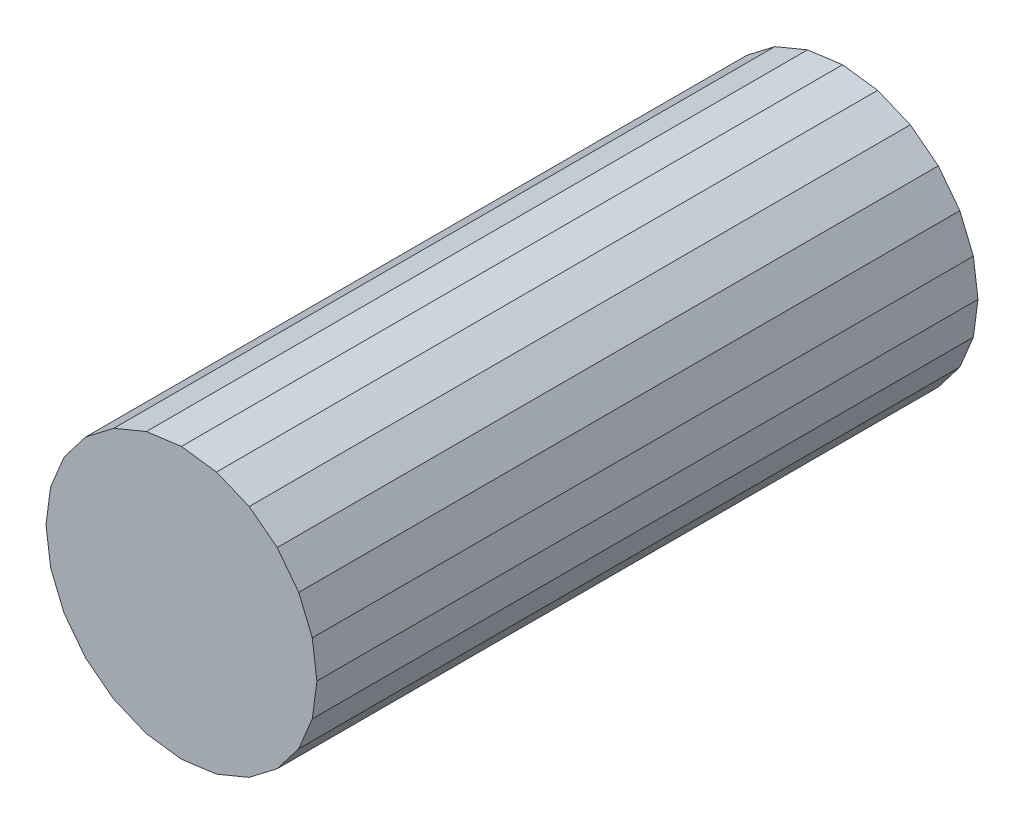
ISO-10303-21;
HEADER;
FILE_DESCRIPTION(('STEP AP214'),'2;1');
FILE_NAME('part.step','',(''),(''),'','','');
FILE_SCHEMA(('AUTOMOTIVE_DESIGN { 1 0 10303 214 1 1 1 1 }'));
ENDSEC;
DATA;
#1=APPLICATION_CONTEXT('core data for automotive mechanical design processes');
#2=APPLICATION_PROTOCOL_DEFINITION('international standard','automotive_design',2000,#1);
#3=PRODUCT_CONTEXT('',#1,'mechanical');
#4=PRODUCT('Part','Part','',(#3));
#5=PRODUCT_RELATED_PRODUCT_CATEGORY('part','',(#4));
#6=PRODUCT_DEFINITION_FORMATION('','',#4);
#7=PRODUCT_DEFINITION_CONTEXT('part definition',#1,'design');
#8=PRODUCT_DEFINITION('design','',#6,#7);
#9=PRODUCT_DEFINITION_SHAPE('','',#8);
#10=(LENGTH_UNIT() NAMED_UNIT(*) SI_UNIT(.MILLI.,.METRE.));
#11=(NAMED_UNIT(*) PLANE_ANGLE_UNIT() SI_UNIT($,.RADIAN.));
#12=(NAMED_UNIT(*) SI_UNIT($,.STERADIAN.) SOLID_ANGLE_UNIT());
#13=UNCERTAINTY_MEASURE_WITH_UNIT(LENGTH_MEASURE(1.E-05),#10,'distance_accuracy_value','');
#14=(GEOMETRIC_REPRESENTATION_CONTEXT(3) GLOBAL_UNCERTAINTY_ASSIGNED_CONTEXT((#13)) GLOBAL_UNIT_ASSIGNED_CONTEXT((#10,
#11,#12)) REPRESENTATION_CONTEXT('',''));
#15=CARTESIAN_POINT('',(0.,0.,0.));
#16=DIRECTION('',(0.,0.,1.));
#17=DIRECTION('',(1.,0.,0.));
#18=AXIS2_PLACEMENT_3D('',#15,#16,#17);
#19=CARTESIAN_POINT('',(0.,-1.3316839,0.));
#20=DIRECTION('',(-0.130529167982954,-0.991444469602649,0.));
#21=DIRECTION('',(0.991444469602649,-0.130529167982954,0.));
#22=AXIS2_PLACEMENT_3D('',#19,#20,#21);
#23=PLANE('',#22);
#24=DIRECTION('',(0.,0.,1.));
#25=VECTOR('',#24,1.);
#26=CARTESIAN_POINT('',(-0.3446653,-1.2863068,0.));
#27=LINE('',#26,#25);
#28=CARTESIAN_POINT('',(-0.3446653,-1.28630680000001,0.));
#29=VERTEX_POINT('',#28);
#30=CARTESIAN_POINT('',(-0.3446653,-1.28630680000001,6.4999997));
#31=VERTEX_POINT('',#30);
#32=EDGE_CURVE('E233',#29,#31,#27,.T.);
#33=ORIENTED_EDGE('',*,*,#32,.F.);
#34=DIRECTION('',(0.991444469602649,-0.130529167982954,0.));
#35=VECTOR('',#34,1.);
#36=CARTESIAN_POINT('',(0.,-1.3316839,0.));
#37=LINE('',#36,#35);
#38=CARTESIAN_POINT('',(0.,-1.3316839,0.));
#39=VERTEX_POINT('',#38);
#40=EDGE_CURVE('E224',#29,#39,#37,.T.);
#41=ORIENTED_EDGE('',*,*,#40,.T.);
#42=DIRECTION('',(0.,0.,1.));
#43=VECTOR('',#42,1.);
#44=CARTESIAN_POINT('',(0.,-1.33168389999999,0.));
#45=LINE('',#44,#43);
#46=CARTESIAN_POINT('',(0.,-1.3316839,6.4999997));
#47=VERTEX_POINT('',#46);
#48=EDGE_CURVE('E235',#47,#39,#45,.F.);
#49=ORIENTED_EDGE('',*,*,#48,.F.);
#50=DIRECTION('',(0.991444469602649,-0.130529167982954,0.));
#51=VECTOR('',#50,1.);
#52=CARTESIAN_POINT('',(0.,-1.3316839,6.4999997));
#53=LINE('',#52,#51);
#54=EDGE_CURVE('E20',#47,#31,#53,.F.);
#55=ORIENTED_EDGE('',*,*,#54,.T.);
#56=EDGE_LOOP('',(#33,#41,#49,#55));
#57=FACE_BOUND('',#56,.T.);
#58=ADVANCED_FACE('F17',(#57),#23,.T.);
#59=CARTESIAN_POINT('',(-0.3446653,-1.2863068,0.));
#60=DIRECTION('',(-0.382683043701045,-0.923879693501109,0.));
#61=DIRECTION('',(0.923879693501109,-0.382683043701045,0.));
#62=AXIS2_PLACEMENT_3D('',#59,#60,#61);
#63=PLANE('',#62);
#64=DIRECTION('',(0.,0.,1.));
#65=VECTOR('',#64,1.);
#66=CARTESIAN_POINT('',(-0.66584068,-1.15327176,0.));
#67=LINE('',#66,#65);
#68=CARTESIAN_POINT('',(-0.665840679999975,-1.15327175999994,0.));
#69=VERTEX_POINT('',#68);
#70=CARTESIAN_POINT('',(-0.665840679999975,-1.15327175999994,6.4999997));
#71=VERTEX_POINT('',#70);
#72=EDGE_CURVE('E276',#69,#71,#67,.T.);
#73=ORIENTED_EDGE('',*,*,#72,.F.);
#74=DIRECTION('',(0.923879693501109,-0.382683043701045,0.));
#75=VECTOR('',#74,1.);
#76=CARTESIAN_POINT('',(-0.3446653,-1.2863068,0.));
#77=LINE('',#76,#75);
#78=EDGE_CURVE('E245',#69,#29,#77,.T.);
#79=ORIENTED_EDGE('',*,*,#78,.T.);
#80=ORIENTED_EDGE('',*,*,#32,.T.);
#81=DIRECTION('',(0.923879693501109,-0.382683043701045,0.));
#82=VECTOR('',#81,1.);
#83=CARTESIAN_POINT('',(-0.3446653,-1.2863068,6.4999997));
#84=LINE('',#83,#82);
#85=EDGE_CURVE('E243',#31,#71,#84,.F.);
#86=ORIENTED_EDGE('',*,*,#85,.T.);
#87=EDGE_LOOP('',(#73,#79,#80,#86));
#88=FACE_BOUND('',#87,.T.);
#89=ADVANCED_FACE('F242',(#88),#63,.T.);
#90=CARTESIAN_POINT('',(0.3446653,-1.2863068,0.));
#91=DIRECTION('',(0.130529167982954,-0.991444469602649,0.));
#92=DIRECTION('',(0.991444469602649,0.130529167982954,0.));
#93=AXIS2_PLACEMENT_3D('',#90,#91,#92);
#94=PLANE('',#93);
#95=ORIENTED_EDGE('',*,*,#48,.T.);
#96=DIRECTION('',(0.991444469602649,0.130529167982954,0.));
#97=VECTOR('',#96,1.);
#98=CARTESIAN_POINT('',(0.3446653,-1.2863068,0.));
#99=LINE('',#98,#97);
#100=CARTESIAN_POINT('',(0.344665300000012,-1.28630680000003,0.));
#101=VERTEX_POINT('',#100);
#102=EDGE_CURVE('E268',#39,#101,#99,.T.);
#103=ORIENTED_EDGE('',*,*,#102,.T.);
#104=DIRECTION('',(0.,0.,1.));
#105=VECTOR('',#104,1.);
#106=CARTESIAN_POINT('',(0.34466530000005,-1.28630680000012,0.));
#107=LINE('',#106,#105);
#108=CARTESIAN_POINT('',(0.344665300000012,-1.28630680000003,6.4999997));
#109=VERTEX_POINT('',#108);
#110=EDGE_CURVE('E287',#109,#101,#107,.F.);
#111=ORIENTED_EDGE('',*,*,#110,.F.);
#112=DIRECTION('',(0.991444469602649,0.130529167982954,0.));
#113=VECTOR('',#112,1.);
#114=CARTESIAN_POINT('',(0.3446653,-1.2863068,6.4999997));
#115=LINE('',#114,#113);
#116=EDGE_CURVE('E259',#109,#47,#115,.F.);
#117=ORIENTED_EDGE('',*,*,#116,.T.);
#118=EDGE_LOOP('',(#95,#103,#111,#117));
#119=FACE_BOUND('',#118,.T.);
#120=ADVANCED_FACE('F266',(#119),#94,.T.);
#121=CARTESIAN_POINT('',(-0.66584068,-1.15327176,0.));
#122=DIRECTION('',(-0.608762963437942,-0.793352162879925,0.));
#123=DIRECTION('',(0.793352162879925,-0.608762963437942,0.));
#124=AXIS2_PLACEMENT_3D('',#121,#122,#123);
#125=PLANE('',#124);
#126=DIRECTION('',(0.,0.,1.));
#127=VECTOR('',#126,1.);
#128=CARTESIAN_POINT('',(-0.9416415,-0.9416415,0.));
#129=LINE('',#128,#127);
#130=CARTESIAN_POINT('',(-0.941641500000008,-0.94164150000001,0.));
#131=VERTEX_POINT('',#130);
#132=CARTESIAN_POINT('',(-0.941641500000008,-0.94164150000001,6.4999997));
#133=VERTEX_POINT('',#132);
#134=EDGE_CURVE('E330',#131,#133,#129,.T.);
#135=ORIENTED_EDGE('',*,*,#134,.F.);
#136=DIRECTION('',(0.793352162879925,-0.608762963437942,0.));
#137=VECTOR('',#136,1.);
#138=CARTESIAN_POINT('',(-0.66584068,-1.15327176,0.));
#139=LINE('',#138,#137);
#140=EDGE_CURVE('E288',#131,#69,#139,.T.);
#141=ORIENTED_EDGE('',*,*,#140,.T.);
#142=ORIENTED_EDGE('',*,*,#72,.T.);
#143=DIRECTION('',(0.793352162879925,-0.608762963437942,0.));
#144=VECTOR('',#143,1.);
#145=CARTESIAN_POINT('',(-0.66584068,-1.15327176,6.4999997));
#146=LINE('',#145,#144);
#147=EDGE_CURVE('E252',#71,#133,#146,.F.);
#148=ORIENTED_EDGE('',*,*,#147,.T.);
#149=EDGE_LOOP('',(#135,#141,#142,#148));
#150=FACE_BOUND('',#149,.T.);
#151=ADVANCED_FACE('F548',(#150),#125,.T.);
#152=CARTESIAN_POINT('',(0.66584068,-1.15327176,0.));
#153=DIRECTION('',(0.382683043701045,-0.923879693501109,0.));
#154=DIRECTION('',(0.923879693501109,0.382683043701045,0.));
#155=AXIS2_PLACEMENT_3D('',#152,#153,#154);
#156=PLANE('',#155);
#157=ORIENTED_EDGE('',*,*,#110,.T.);
#158=DIRECTION('',(0.923879693501109,0.382683043701045,0.));
#159=VECTOR('',#158,1.);
#160=CARTESIAN_POINT('',(0.66584068,-1.15327176,0.));
#161=LINE('',#160,#159);
#162=CARTESIAN_POINT('',(0.665840679999996,-1.15327175999999,0.));
#163=VERTEX_POINT('',#162);
#164=EDGE_CURVE('E275',#101,#163,#161,.T.);
#165=ORIENTED_EDGE('',*,*,#164,.T.);
#166=DIRECTION('',(0.,0.,1.));
#167=VECTOR('',#166,1.);
#168=CARTESIAN_POINT('',(0.665840679999984,-1.15327175999998,0.));
#169=LINE('',#168,#167);
#170=CARTESIAN_POINT('',(0.665840679999996,-1.15327175999999,6.4999997));
#171=VERTEX_POINT('',#170);
#172=EDGE_CURVE('E292',#171,#163,#169,.F.);
#173=ORIENTED_EDGE('',*,*,#172,.F.);
#174=DIRECTION('',(0.923879693501109,0.382683043701045,0.));
#175=VECTOR('',#174,1.);
#176=CARTESIAN_POINT('',(0.66584068,-1.15327176,6.4999997));
#177=LINE('',#176,#175);
#178=EDGE_CURVE('E285',#171,#109,#177,.F.);
#179=ORIENTED_EDGE('',*,*,#178,.T.);
#180=EDGE_LOOP('',(#157,#165,#173,#179));
#181=FACE_BOUND('',#180,.T.);
#182=ADVANCED_FACE('F545',(#181),#156,.T.);
#183=CARTESIAN_POINT('',(-0.9416415,-0.9416415,0.));
#184=DIRECTION('',(-0.79334945515604,-0.608766492182031,0.));
#185=DIRECTION('',(0.608766492182031,-0.79334945515604,0.));
#186=AXIS2_PLACEMENT_3D('',#183,#184,#185);
#187=PLANE('',#186);
#188=DIRECTION('',(0.,0.,1.));
#189=VECTOR('',#188,1.);
#190=CARTESIAN_POINT('',(-1.15327176,-0.66584322,0.));
#191=LINE('',#190,#189);
#192=CARTESIAN_POINT('',(-1.15327175999996,-0.665843219999971,0.));
#193=VERTEX_POINT('',#192);
#194=CARTESIAN_POINT('',(-1.15327175999996,-0.665843219999971,6.4999997));
#195=VERTEX_POINT('',#194);
#196=EDGE_CURVE('E341',#193,#195,#191,.T.);
#197=ORIENTED_EDGE('',*,*,#196,.F.);
#198=DIRECTION('',(0.608766492182031,-0.79334945515604,0.));
#199=VECTOR('',#198,1.);
#200=CARTESIAN_POINT('',(-0.9416415,-0.9416415,0.));
#201=LINE('',#200,#199);
#202=EDGE_CURVE('E293',#193,#131,#201,.T.);
#203=ORIENTED_EDGE('',*,*,#202,.T.);
#204=ORIENTED_EDGE('',*,*,#134,.T.);
#205=DIRECTION('',(0.608766492182031,-0.79334945515604,0.));
#206=VECTOR('',#205,1.);
#207=CARTESIAN_POINT('',(-0.9416415,-0.9416415,6.4999997));
#208=LINE('',#207,#206);
#209=EDGE_CURVE('E320',#133,#195,#208,.F.);
#210=ORIENTED_EDGE('',*,*,#209,.T.);
#211=EDGE_LOOP('',(#197,#203,#204,#210));
#212=FACE_BOUND('',#211,.T.);
#213=ADVANCED_FACE('F547',(#212),#187,.T.);
#214=CARTESIAN_POINT('',(0.9416415,-0.9416415,0.));
#215=DIRECTION('',(0.608762963437942,-0.793352162879925,0.));
#216=DIRECTION('',(0.793352162879925,0.608762963437942,0.));
#217=AXIS2_PLACEMENT_3D('',#214,#215,#216);
#218=PLANE('',#217);
#219=ORIENTED_EDGE('',*,*,#172,.T.);
#220=DIRECTION('',(0.793352162879925,0.608762963437942,0.));
#221=VECTOR('',#220,1.);
#222=CARTESIAN_POINT('',(0.9416415,-0.9416415,0.));
#223=LINE('',#222,#221);
#224=CARTESIAN_POINT('',(0.941641500000019,-0.941641500000014,0.));
#225=VERTEX_POINT('',#224);
#226=EDGE_CURVE('E338',#163,#225,#223,.T.);
#227=ORIENTED_EDGE('',*,*,#226,.T.);
#228=DIRECTION('',(0.,0.,1.));
#229=VECTOR('',#228,1.);
#230=CARTESIAN_POINT('',(0.941641500000074,-0.941641500000057,0.));
#231=LINE('',#230,#229);
#232=CARTESIAN_POINT('',(0.941641500000019,-0.941641500000014,6.4999997));
#233=VERTEX_POINT('',#232);
#234=EDGE_CURVE('E297',#233,#225,#231,.F.);
#235=ORIENTED_EDGE('',*,*,#234,.F.);
#236=DIRECTION('',(0.793352162879925,0.608762963437942,0.));
#237=VECTOR('',#236,1.);
#238=CARTESIAN_POINT('',(0.9416415,-0.9416415,6.4999997));
#239=LINE('',#238,#237);
#240=EDGE_CURVE('E290',#233,#171,#239,.F.);
#241=ORIENTED_EDGE('',*,*,#240,.T.);
#242=EDGE_LOOP('',(#219,#227,#235,#241));
#243=FACE_BOUND('',#242,.T.);
#244=ADVANCED_FACE('F541',(#243),#218,.T.);
#245=CARTESIAN_POINT('',(-1.15327176,-0.66584322,0.));
#246=DIRECTION('',(-0.923880763494145,-0.38268046049606,0.));
#247=DIRECTION('',(0.38268046049606,-0.923880763494145,0.));
#248=AXIS2_PLACEMENT_3D('',#245,#246,#247);
#249=PLANE('',#248);
#250=DIRECTION('',(0.,0.,1.));
#251=VECTOR('',#250,1.);
#252=CARTESIAN_POINT('',(-1.2863068,-0.3446653,0.));
#253=LINE('',#252,#251);
#254=CARTESIAN_POINT('',(-1.28630680000004,-0.344665300000018,0.));
#255=VERTEX_POINT('',#254);
#256=CARTESIAN_POINT('',(-1.28630680000004,-0.344665300000018,6.4999997));
#257=VERTEX_POINT('',#256);
#258=EDGE_CURVE('E353',#255,#257,#253,.T.);
#259=ORIENTED_EDGE('',*,*,#258,.F.);
#260=DIRECTION('',(0.38268046049606,-0.923880763494145,0.));
#261=VECTOR('',#260,1.);
#262=CARTESIAN_POINT('',(-1.15327176,-0.66584322,0.));
#263=LINE('',#262,#261);
#264=EDGE_CURVE('E298',#255,#193,#263,.T.);
#265=ORIENTED_EDGE('',*,*,#264,.T.);
#266=ORIENTED_EDGE('',*,*,#196,.T.);
#267=DIRECTION('',(0.38268046049606,-0.923880763494145,0.));
#268=VECTOR('',#267,1.);
#269=CARTESIAN_POINT('',(-1.15327176,-0.66584322,6.4999997));
#270=LINE('',#269,#268);
#271=EDGE_CURVE('E316',#195,#257,#270,.F.);
#272=ORIENTED_EDGE('',*,*,#271,.T.);
#273=EDGE_LOOP('',(#259,#265,#266,#272));
#274=FACE_BOUND('',#273,.T.);
#275=ADVANCED_FACE('F609',(#274),#249,.T.);
#276=CARTESIAN_POINT('',(1.15327176,-0.66584322,0.));
#277=DIRECTION('',(0.79334945515604,-0.608766492182031,0.));
#278=DIRECTION('',(0.608766492182031,0.79334945515604,0.));
#279=AXIS2_PLACEMENT_3D('',#276,#277,#278);
#280=PLANE('',#279);
#281=ORIENTED_EDGE('',*,*,#234,.T.);
#282=DIRECTION('',(0.608766492182031,0.79334945515604,0.));
#283=VECTOR('',#282,1.);
#284=CARTESIAN_POINT('',(1.15327176,-0.66584322,0.));
#285=LINE('',#284,#283);
#286=CARTESIAN_POINT('',(1.15327175999998,-0.665843219999991,0.));
#287=VERTEX_POINT('',#286);
#288=EDGE_CURVE('E350',#225,#287,#285,.T.);
#289=ORIENTED_EDGE('',*,*,#288,.T.);
#290=DIRECTION('',(0.,0.,1.));
#291=VECTOR('',#290,1.);
#292=CARTESIAN_POINT('',(1.15327175999991,-0.665843219999964,0.));
#293=LINE('',#292,#291);
#294=CARTESIAN_POINT('',(1.15327175999998,-0.665843219999992,6.4999997));
#295=VERTEX_POINT('',#294);
#296=EDGE_CURVE('E307',#295,#287,#293,.F.);
#297=ORIENTED_EDGE('',*,*,#296,.F.);
#298=DIRECTION('',(0.608766492182031,0.79334945515604,0.));
#299=VECTOR('',#298,1.);
#300=CARTESIAN_POINT('',(1.15327176,-0.66584322,6.4999997));
#301=LINE('',#300,#299);
#302=EDGE_CURVE('E295',#295,#233,#301,.F.);
#303=ORIENTED_EDGE('',*,*,#302,.T.);
#304=EDGE_LOOP('',(#281,#289,#297,#303));
#305=FACE_BOUND('',#304,.T.);
#306=ADVANCED_FACE('F537',(#305),#280,.T.);
#307=CARTESIAN_POINT('',(-1.2863068,-0.3446653,0.));
#308=DIRECTION('',(-0.991444469602649,-0.130529167982954,0.));
#309=DIRECTION('',(0.130529167982954,-0.991444469602649,0.));
#310=AXIS2_PLACEMENT_3D('',#307,#308,#309);
#311=PLANE('',#310);
#312=DIRECTION('',(0.,0.,1.));
#313=VECTOR('',#312,1.);
#314=CARTESIAN_POINT('',(-1.3316839,0.,0.));
#315=LINE('',#314,#313);
#316=CARTESIAN_POINT('',(-1.33168389999999,0.,0.));
#317=VERTEX_POINT('',#316);
#318=CARTESIAN_POINT('',(-1.33168389999999,0.,6.4999997));
#319=VERTEX_POINT('',#318);
#320=EDGE_CURVE('E365',#317,#319,#315,.T.);
#321=ORIENTED_EDGE('',*,*,#320,.F.);
#322=DIRECTION('',(0.130529167982954,-0.991444469602649,0.));
#323=VECTOR('',#322,1.);
#324=CARTESIAN_POINT('',(-1.2863068,-0.3446653,0.));
#325=LINE('',#324,#323);
#326=EDGE_CURVE('E308',#317,#255,#325,.T.);
#327=ORIENTED_EDGE('',*,*,#326,.T.);
#328=ORIENTED_EDGE('',*,*,#258,.T.);
#329=DIRECTION('',(0.130529167982954,-0.991444469602649,0.));
#330=VECTOR('',#329,1.);
#331=CARTESIAN_POINT('',(-1.2863068,-0.3446653,6.4999997));
#332=LINE('',#331,#330);
#333=EDGE_CURVE('E312',#257,#319,#332,.F.);
#334=ORIENTED_EDGE('',*,*,#333,.T.);
#335=EDGE_LOOP('',(#321,#327,#328,#334));
#336=FACE_BOUND('',#335,.T.);
#337=ADVANCED_FACE('F603',(#336),#311,.T.);
#338=CARTESIAN_POINT('',(1.2863068,-0.3446653,0.));
#339=DIRECTION('',(0.923880763494145,-0.38268046049606,0.));
#340=DIRECTION('',(0.38268046049606,0.923880763494145,0.));
#341=AXIS2_PLACEMENT_3D('',#338,#339,#340);
#342=PLANE('',#341);
#343=ORIENTED_EDGE('',*,*,#296,.T.);
#344=DIRECTION('',(0.38268046049606,0.923880763494145,0.));
#345=VECTOR('',#344,1.);
#346=CARTESIAN_POINT('',(1.2863068,-0.3446653,0.));
#347=LINE('',#346,#345);
#348=CARTESIAN_POINT('',(1.2863068,-0.344665300000001,0.));
#349=VERTEX_POINT('',#348);
#350=EDGE_CURVE('E362',#287,#349,#347,.T.);
#351=ORIENTED_EDGE('',*,*,#350,.T.);
#352=DIRECTION('',(0.,0.,1.));
#353=VECTOR('',#352,1.);
#354=CARTESIAN_POINT('',(1.28630680000001,-0.344665300000002,0.));
#355=LINE('',#354,#353);
#356=CARTESIAN_POINT('',(1.2863068,-0.344665300000001,6.4999997));
#357=VERTEX_POINT('',#356);
#358=EDGE_CURVE('E302',#357,#349,#355,.F.);
#359=ORIENTED_EDGE('',*,*,#358,.F.);
#360=DIRECTION('',(0.38268046049606,0.923880763494145,0.));
#361=VECTOR('',#360,1.);
#362=CARTESIAN_POINT('',(1.2863068,-0.3446653,6.4999997));
#363=LINE('',#362,#361);
#364=EDGE_CURVE('E305',#357,#295,#363,.F.);
#365=ORIENTED_EDGE('',*,*,#364,.T.);
#366=EDGE_LOOP('',(#343,#351,#359,#365));
#367=FACE_BOUND('',#366,.T.);
#368=ADVANCED_FACE('F533',(#367),#342,.T.);
#369=CARTESIAN_POINT('',(-1.3316839,0.,0.));
#370=DIRECTION('',(-0.991444469602649,0.130529167982954,0.));
#371=DIRECTION('',(-0.130529167982954,-0.991444469602649,0.));
#372=AXIS2_PLACEMENT_3D('',#369,#370,#371);
#373=PLANE('',#372);
#374=DIRECTION('',(0.,0.,1.));
#375=VECTOR('',#374,1.);
#376=CARTESIAN_POINT('',(-1.2863068,0.3446653,0.));
#377=LINE('',#376,#375);
#378=CARTESIAN_POINT('',(-1.28630680000001,0.344665300000001,0.));
#379=VERTEX_POINT('',#378);
#380=CARTESIAN_POINT('',(-1.28630680000001,0.344665300000001,6.4999997));
#381=VERTEX_POINT('',#380);
#382=EDGE_CURVE('E381',#379,#381,#377,.T.);
#383=ORIENTED_EDGE('',*,*,#382,.F.);
#384=DIRECTION('',(-0.130529167982954,-0.991444469602649,0.));
#385=VECTOR('',#384,1.);
#386=CARTESIAN_POINT('',(-1.3316839,0.,0.));
#387=LINE('',#386,#385);
#388=EDGE_CURVE('E303',#379,#317,#387,.T.);
#389=ORIENTED_EDGE('',*,*,#388,.T.);
#390=ORIENTED_EDGE('',*,*,#320,.T.);
#391=DIRECTION('',(-0.130529167982954,-0.991444469602649,0.));
#392=VECTOR('',#391,1.);
#393=CARTESIAN_POINT('',(-1.3316839,0.,6.4999997));
#394=LINE('',#393,#392);
#395=EDGE_CURVE('E369',#319,#381,#394,.F.);
#396=ORIENTED_EDGE('',*,*,#395,.T.);
#397=EDGE_LOOP('',(#383,#389,#390,#396));
#398=FACE_BOUND('',#397,.T.);
#399=ADVANCED_FACE('F597',(#398),#373,.T.);
#400=CARTESIAN_POINT('',(1.3316839,0.,0.));
#401=DIRECTION('',(0.991444469602649,-0.130529167982954,0.));
#402=DIRECTION('',(0.130529167982954,0.991444469602649,0.));
#403=AXIS2_PLACEMENT_3D('',#400,#401,#402);
#404=PLANE('',#403);
#405=ORIENTED_EDGE('',*,*,#358,.T.);
#406=DIRECTION('',(0.130529167982954,0.991444469602649,0.));
#407=VECTOR('',#406,1.);
#408=CARTESIAN_POINT('',(1.3316839,0.,0.));
#409=LINE('',#408,#407);
#410=CARTESIAN_POINT('',(1.3316839,0.,0.));
#411=VERTEX_POINT('',#410);
#412=EDGE_CURVE('E378',#349,#411,#409,.T.);
#413=ORIENTED_EDGE('',*,*,#412,.T.);
#414=DIRECTION('',(0.,0.,1.));
#415=VECTOR('',#414,1.);
#416=CARTESIAN_POINT('',(1.33168389999999,0.,0.));
#417=LINE('',#416,#415);
#418=CARTESIAN_POINT('',(1.3316839,0.,6.4999997));
#419=VERTEX_POINT('',#418);
#420=EDGE_CURVE('E395',#419,#411,#417,.F.);
#421=ORIENTED_EDGE('',*,*,#420,.F.);
#422=DIRECTION('',(0.130529167982954,0.991444469602649,0.));
#423=VECTOR('',#422,1.);
#424=CARTESIAN_POINT('',(1.3316839,0.,6.4999997));
#425=LINE('',#424,#423);
#426=EDGE_CURVE('E300',#419,#357,#425,.F.);
#427=ORIENTED_EDGE('',*,*,#426,.T.);
#428=EDGE_LOOP('',(#405,#413,#421,#427));
#429=FACE_BOUND('',#428,.T.);
#430=ADVANCED_FACE('F529',(#429),#404,.T.);
#431=CARTESIAN_POINT('',(-1.2863068,0.3446653,0.));
#432=DIRECTION('',(-0.923880763494145,0.38268046049606,0.));
#433=DIRECTION('',(-0.38268046049606,-0.923880763494145,0.));
#434=AXIS2_PLACEMENT_3D('',#431,#432,#433);
#435=PLANE('',#434);
#436=DIRECTION('',(0.,0.,1.));
#437=VECTOR('',#436,1.);
#438=CARTESIAN_POINT('',(-1.15327176,0.66584322,0.));
#439=LINE('',#438,#437);
#440=CARTESIAN_POINT('',(-1.15327175999996,0.665843219999982,0.));
#441=VERTEX_POINT('',#440);
#442=CARTESIAN_POINT('',(-1.15327175999996,0.665843219999982,6.4999997));
#443=VERTEX_POINT('',#442);
#444=EDGE_CURVE('E402',#441,#443,#439,.T.);
#445=ORIENTED_EDGE('',*,*,#444,.F.);
#446=DIRECTION('',(-0.38268046049606,-0.923880763494145,0.));
#447=VECTOR('',#446,1.);
#448=CARTESIAN_POINT('',(-1.2863068,0.3446653,0.));
#449=LINE('',#448,#447);
#450=EDGE_CURVE('E388',#441,#379,#449,.T.);
#451=ORIENTED_EDGE('',*,*,#450,.T.);
#452=ORIENTED_EDGE('',*,*,#382,.T.);
#453=DIRECTION('',(-0.38268046049606,-0.923880763494145,0.));
#454=VECTOR('',#453,1.);
#455=CARTESIAN_POINT('',(-1.2863068,0.3446653,6.4999997));
#456=LINE('',#455,#454);
#457=EDGE_CURVE('E385',#381,#443,#456,.F.);
#458=ORIENTED_EDGE('',*,*,#457,.T.);
#459=EDGE_LOOP('',(#445,#451,#452,#458));
#460=FACE_BOUND('',#459,.T.);
#461=ADVANCED_FACE('F591',(#460),#435,.T.);
#462=CARTESIAN_POINT('',(1.2863068,0.3446653,0.));
#463=DIRECTION('',(0.991444469602649,0.130529167982954,0.));
#464=DIRECTION('',(-0.130529167982954,0.991444469602649,0.));
#465=AXIS2_PLACEMENT_3D('',#462,#463,#464);
#466=PLANE('',#465);
#467=ORIENTED_EDGE('',*,*,#420,.T.);
#468=DIRECTION('',(-0.130529167982954,0.991444469602649,0.));
#469=VECTOR('',#468,1.);
#470=CARTESIAN_POINT('',(1.2863068,0.3446653,0.));
#471=LINE('',#470,#469);
#472=CARTESIAN_POINT('',(1.28630680000002,0.344665300000009,0.));
#473=VERTEX_POINT('',#472);
#474=EDGE_CURVE('E399',#411,#473,#471,.T.);
#475=ORIENTED_EDGE('',*,*,#474,.T.);
#476=DIRECTION('',(0.,0.,1.));
#477=VECTOR('',#476,1.);
#478=CARTESIAN_POINT('',(1.28630680000009,0.344665300000035,0.));
#479=LINE('',#478,#477);
#480=CARTESIAN_POINT('',(1.28630680000002,0.344665300000008,6.4999997));
#481=VERTEX_POINT('',#480);
#482=EDGE_CURVE('E416',#481,#473,#479,.F.);
#483=ORIENTED_EDGE('',*,*,#482,.F.);
#484=DIRECTION('',(-0.130529167982954,0.991444469602649,0.));
#485=VECTOR('',#484,1.);
#486=CARTESIAN_POINT('',(1.2863068,0.3446653,6.4999997));
#487=LINE('',#486,#485);
#488=EDGE_CURVE('E392',#481,#419,#487,.F.);
#489=ORIENTED_EDGE('',*,*,#488,.T.);
#490=EDGE_LOOP('',(#467,#475,#483,#489));
#491=FACE_BOUND('',#490,.T.);
#492=ADVANCED_FACE('F522',(#491),#466,.T.);
#493=CARTESIAN_POINT('',(-1.15327176,0.66584322,0.));
#494=DIRECTION('',(-0.79334945515604,0.608766492182031,0.));
#495=DIRECTION('',(-0.608766492182031,-0.79334945515604,0.));
#496=AXIS2_PLACEMENT_3D('',#493,#494,#495);
#497=PLANE('',#496);
#498=DIRECTION('',(0.,0.,1.));
#499=VECTOR('',#498,1.);
#500=CARTESIAN_POINT('',(-0.9416415,0.9416415,0.));
#501=LINE('',#500,#499);
#502=CARTESIAN_POINT('',(-0.941641500000037,0.941641500000028,0.));
#503=VERTEX_POINT('',#502);
#504=CARTESIAN_POINT('',(-0.941641500000037,0.941641500000028,6.4999997));
#505=VERTEX_POINT('',#504);
#506=EDGE_CURVE('E423',#503,#505,#501,.T.);
#507=ORIENTED_EDGE('',*,*,#506,.F.);
#508=DIRECTION('',(-0.608766492182031,-0.79334945515604,0.));
#509=VECTOR('',#508,1.);
#510=CARTESIAN_POINT('',(-1.15327176,0.66584322,0.));
#511=LINE('',#510,#509);
#512=EDGE_CURVE('E409',#503,#441,#511,.T.);
#513=ORIENTED_EDGE('',*,*,#512,.T.);
#514=ORIENTED_EDGE('',*,*,#444,.T.);
#515=DIRECTION('',(-0.608766492182031,-0.79334945515604,0.));
#516=VECTOR('',#515,1.);
#517=CARTESIAN_POINT('',(-1.15327176,0.66584322,6.4999997));
#518=LINE('',#517,#516);
#519=EDGE_CURVE('E406',#443,#505,#518,.F.);
#520=ORIENTED_EDGE('',*,*,#519,.T.);
#521=EDGE_LOOP('',(#507,#513,#514,#520));
#522=FACE_BOUND('',#521,.T.);
#523=ADVANCED_FACE('F585',(#522),#497,.T.);
#524=CARTESIAN_POINT('',(1.15327176,0.66584322,0.));
#525=DIRECTION('',(0.923880763494145,0.38268046049606,0.));
#526=DIRECTION('',(-0.38268046049606,0.923880763494145,0.));
#527=AXIS2_PLACEMENT_3D('',#524,#525,#526);
#528=PLANE('',#527);
#529=ORIENTED_EDGE('',*,*,#482,.T.);
#530=DIRECTION('',(-0.38268046049606,0.923880763494145,0.));
#531=VECTOR('',#530,1.);
#532=CARTESIAN_POINT('',(1.15327176,0.66584322,0.));
#533=LINE('',#532,#531);
#534=CARTESIAN_POINT('',(1.15327175999998,0.665843219999986,0.));
#535=VERTEX_POINT('',#534);
#536=EDGE_CURVE('E420',#473,#535,#533,.T.);
#537=ORIENTED_EDGE('',*,*,#536,.T.);
#538=DIRECTION('',(0.,0.,1.));
#539=VECTOR('',#538,1.);
#540=CARTESIAN_POINT('',(1.15327175999993,0.665843219999943,0.));
#541=LINE('',#540,#539);
#542=CARTESIAN_POINT('',(1.15327175999998,0.665843219999986,6.4999997));
#543=VERTEX_POINT('',#542);
#544=EDGE_CURVE('E437',#543,#535,#541,.F.);
#545=ORIENTED_EDGE('',*,*,#544,.F.);
#546=DIRECTION('',(-0.38268046049606,0.923880763494145,0.));
#547=VECTOR('',#546,1.);
#548=CARTESIAN_POINT('',(1.15327176,0.66584322,6.4999997));
#549=LINE('',#548,#547);
#550=EDGE_CURVE('E413',#543,#481,#549,.F.);
#551=ORIENTED_EDGE('',*,*,#550,.T.);
#552=EDGE_LOOP('',(#529,#537,#545,#551));
#553=FACE_BOUND('',#552,.T.);
#554=ADVANCED_FACE('F518',(#553),#528,.T.);
#555=CARTESIAN_POINT('',(-0.9416415,0.9416415,0.));
#556=DIRECTION('',(-0.608762963437942,0.793352162879925,0.));
#557=DIRECTION('',(-0.793352162879925,-0.608762963437942,0.));
#558=AXIS2_PLACEMENT_3D('',#555,#556,#557);
#559=PLANE('',#558);
#560=DIRECTION('',(0.,0.,1.));
#561=VECTOR('',#560,1.);
#562=CARTESIAN_POINT('',(-0.66584068,1.15327176,0.));
#563=LINE('',#562,#561);
#564=CARTESIAN_POINT('',(-0.665840679999992,1.15327175999999,0.));
#565=VERTEX_POINT('',#564);
#566=CARTESIAN_POINT('',(-0.665840679999992,1.15327175999999,6.4999997));
#567=VERTEX_POINT('',#566);
#568=EDGE_CURVE('E444',#565,#567,#563,.T.);
#569=ORIENTED_EDGE('',*,*,#568,.F.);
#570=DIRECTION('',(-0.793352162879925,-0.608762963437942,0.));
#571=VECTOR('',#570,1.);
#572=CARTESIAN_POINT('',(-0.9416415,0.9416415,0.));
#573=LINE('',#572,#571);
#574=EDGE_CURVE('E430',#565,#503,#573,.T.);
#575=ORIENTED_EDGE('',*,*,#574,.T.);
#576=ORIENTED_EDGE('',*,*,#506,.T.);
#577=DIRECTION('',(-0.793352162879925,-0.608762963437942,0.));
#578=VECTOR('',#577,1.);
#579=CARTESIAN_POINT('',(-0.9416415,0.9416415,6.4999997));
#580=LINE('',#579,#578);
#581=EDGE_CURVE('E427',#505,#567,#580,.F.);
#582=ORIENTED_EDGE('',*,*,#581,.T.);
#583=EDGE_LOOP('',(#569,#575,#576,#582));
#584=FACE_BOUND('',#583,.T.);
#585=ADVANCED_FACE('F579',(#584),#559,.T.);
#586=CARTESIAN_POINT('',(0.9416415,0.9416415,0.));
#587=DIRECTION('',(0.79334945515604,0.608766492182031,0.));
#588=DIRECTION('',(-0.608766492182031,0.79334945515604,0.));
#589=AXIS2_PLACEMENT_3D('',#586,#587,#588);
#590=PLANE('',#589);
#591=ORIENTED_EDGE('',*,*,#544,.T.);
#592=DIRECTION('',(-0.608766492182031,0.79334945515604,0.));
#593=VECTOR('',#592,1.);
#594=CARTESIAN_POINT('',(0.9416415,0.9416415,0.));
#595=LINE('',#594,#593);
#596=CARTESIAN_POINT('',(0.941641500000004,0.941641500000005,0.));
#597=VERTEX_POINT('',#596);
#598=EDGE_CURVE('E441',#535,#597,#595,.T.);
#599=ORIENTED_EDGE('',*,*,#598,.T.);
#600=DIRECTION('',(0.,0.,1.));
#601=VECTOR('',#600,1.);
#602=CARTESIAN_POINT('',(0.941641500000016,0.941641500000021,0.));
#603=LINE('',#602,#601);
#604=CARTESIAN_POINT('',(0.941641500000004,0.941641500000005,6.4999997));
#605=VERTEX_POINT('',#604);
#606=EDGE_CURVE('E455',#605,#597,#603,.F.);
#607=ORIENTED_EDGE('',*,*,#606,.F.);
#608=DIRECTION('',(-0.608766492182031,0.79334945515604,0.));
#609=VECTOR('',#608,1.);
#610=CARTESIAN_POINT('',(0.9416415,0.9416415,6.4999997));
#611=LINE('',#610,#609);
#612=EDGE_CURVE('E434',#605,#543,#611,.F.);
#613=ORIENTED_EDGE('',*,*,#612,.T.);
#614=EDGE_LOOP('',(#591,#599,#607,#613));
#615=FACE_BOUND('',#614,.T.);
#616=ADVANCED_FACE('F514',(#615),#590,.T.);
#617=CARTESIAN_POINT('',(-0.66584068,1.15327176,0.));
#618=DIRECTION('',(-0.382683043701045,0.923879693501109,0.));
#619=DIRECTION('',(-0.923879693501109,-0.382683043701045,0.));
#620=AXIS2_PLACEMENT_3D('',#617,#618,#619);
#621=PLANE('',#620);
#622=DIRECTION('',(0.,0.,1.));
#623=VECTOR('',#622,1.);
#624=CARTESIAN_POINT('',(-0.3446653,1.2863068,0.));
#625=LINE('',#624,#623);
#626=CARTESIAN_POINT('',(-0.344665300000025,1.28630680000006,0.));
#627=VERTEX_POINT('',#626);
#628=CARTESIAN_POINT('',(-0.344665300000025,1.28630680000006,6.4999997));
#629=VERTEX_POINT('',#628);
#630=EDGE_CURVE('E462',#627,#629,#625,.T.);
#631=ORIENTED_EDGE('',*,*,#630,.F.);
#632=DIRECTION('',(-0.923879693501109,-0.382683043701045,0.));
#633=VECTOR('',#632,1.);
#634=CARTESIAN_POINT('',(-0.66584068,1.15327176,0.));
#635=LINE('',#634,#633);
#636=EDGE_CURVE('E451',#627,#565,#635,.T.);
#637=ORIENTED_EDGE('',*,*,#636,.T.);
#638=ORIENTED_EDGE('',*,*,#568,.T.);
#639=DIRECTION('',(-0.923879693501109,-0.382683043701045,0.));
#640=VECTOR('',#639,1.);
#641=CARTESIAN_POINT('',(-0.66584068,1.15327176,6.4999997));
#642=LINE('',#641,#640);
#643=EDGE_CURVE('E448',#567,#629,#642,.F.);
#644=ORIENTED_EDGE('',*,*,#643,.T.);
#645=EDGE_LOOP('',(#631,#637,#638,#644));
#646=FACE_BOUND('',#645,.T.);
#647=ADVANCED_FACE('F573',(#646),#621,.T.);
#648=CARTESIAN_POINT('',(0.66584068,1.15327176,0.));
#649=DIRECTION('',(0.608762963437942,0.793352162879925,0.));
#650=DIRECTION('',(-0.793352162879925,0.608762963437942,0.));
#651=AXIS2_PLACEMENT_3D('',#648,#649,#650);
#652=PLANE('',#651);
#653=ORIENTED_EDGE('',*,*,#606,.T.);
#654=DIRECTION('',(-0.793352162879925,0.608762963437942,0.));
#655=VECTOR('',#654,1.);
#656=CARTESIAN_POINT('',(0.66584068,1.15327176,0.));
#657=LINE('',#656,#655);
#658=CARTESIAN_POINT('',(0.665840679999988,1.15327175999997,0.));
#659=VERTEX_POINT('',#658);
#660=EDGE_CURVE('E459',#597,#659,#657,.T.);
#661=ORIENTED_EDGE('',*,*,#660,.T.);
#662=DIRECTION('',(0.,0.,1.));
#663=VECTOR('',#662,1.);
#664=CARTESIAN_POINT('',(0.66584067999995,1.15327175999988,0.));
#665=LINE('',#664,#663);
#666=CARTESIAN_POINT('',(0.665840679999988,1.15327175999997,6.4999997));
#667=VERTEX_POINT('',#666);
#668=EDGE_CURVE('E481',#667,#659,#665,.F.);
#669=ORIENTED_EDGE('',*,*,#668,.F.);
#670=DIRECTION('',(-0.793352162879879,0.608762963438002,0.));
#671=VECTOR('',#670,1.);
#672=CARTESIAN_POINT('',(0.9416415,0.9416415,6.4999997));
#673=LINE('',#672,#671);
#674=EDGE_CURVE('E474',#605,#667,#673,.T.);
#675=ORIENTED_EDGE('',*,*,#674,.F.);
#676=EDGE_LOOP('',(#653,#661,#669,#675));
#677=FACE_BOUND('',#676,.T.);
#678=ADVANCED_FACE('F508',(#677),#652,.T.);
#679=CARTESIAN_POINT('',(-0.3446653,1.2863068,0.));
#680=DIRECTION('',(-0.130529167982954,0.991444469602649,0.));
#681=DIRECTION('',(-0.991444469602649,-0.130529167982954,0.));
#682=AXIS2_PLACEMENT_3D('',#679,#680,#681);
#683=PLANE('',#682);
#684=DIRECTION('',(0.,0.,1.));
#685=VECTOR('',#684,1.);
#686=CARTESIAN_POINT('',(0.,1.3316839,0.));
#687=LINE('',#686,#685);
#688=CARTESIAN_POINT('',(0.,1.33168389999999,0.));
#689=VERTEX_POINT('',#688);
#690=CARTESIAN_POINT('',(0.,1.33168389999999,6.4999997));
#691=VERTEX_POINT('',#690);
#692=EDGE_CURVE('E486',#689,#691,#687,.T.);
#693=ORIENTED_EDGE('',*,*,#692,.F.);
#694=DIRECTION('',(-0.991444469602649,-0.130529167982954,0.));
#695=VECTOR('',#694,1.);
#696=CARTESIAN_POINT('',(-0.3446653,1.2863068,0.));
#697=LINE('',#696,#695);
#698=EDGE_CURVE('E466',#689,#627,#697,.T.);
#699=ORIENTED_EDGE('',*,*,#698,.T.);
#700=ORIENTED_EDGE('',*,*,#630,.T.);
#701=DIRECTION('',(-0.991444469602645,-0.130529167982986,0.));
#702=VECTOR('',#701,1.);
#703=CARTESIAN_POINT('',(0.,1.3316839,6.4999997));
#704=LINE('',#703,#702);
#705=EDGE_CURVE('E470',#691,#629,#704,.T.);
#706=ORIENTED_EDGE('',*,*,#705,.F.);
#707=EDGE_LOOP('',(#693,#699,#700,#706));
#708=FACE_BOUND('',#707,.T.);
#709=ADVANCED_FACE('F502',(#708),#683,.T.);
#710=CARTESIAN_POINT('',(0.,1.3316839,6.4999997));
#711=DIRECTION('',(0.,0.,1.));
#712=DIRECTION('',(1.,0.,0.));
#713=AXIS2_PLACEMENT_3D('',#710,#711,#712);
#714=PLANE('',#713);
#715=DIRECTION('',(-0.923879693501109,0.382683043701045,0.));
#716=VECTOR('',#715,1.);
#717=CARTESIAN_POINT('',(0.3446653,1.2863068,6.4999997));
#718=LINE('',#717,#716);
#719=CARTESIAN_POINT('',(0.344665299999999,1.2863068,6.4999997));
#720=VERTEX_POINT('',#719);
#721=EDGE_CURVE('E477',#720,#667,#718,.F.);
#722=ORIENTED_EDGE('',*,*,#721,.F.);
#723=DIRECTION('',(-0.991444469602649,0.130529167982954,0.));
#724=VECTOR('',#723,1.);
#725=CARTESIAN_POINT('',(0.,1.3316839,6.4999997));
#726=LINE('',#725,#724);
#727=EDGE_CURVE('E489',#691,#720,#726,.F.);
#728=ORIENTED_EDGE('',*,*,#727,.F.);
#729=ORIENTED_EDGE('',*,*,#705,.T.);
#730=ORIENTED_EDGE('',*,*,#643,.F.);
#731=ORIENTED_EDGE('',*,*,#581,.F.);
#732=ORIENTED_EDGE('',*,*,#519,.F.);
#733=ORIENTED_EDGE('',*,*,#457,.F.);
#734=ORIENTED_EDGE('',*,*,#395,.F.);
#735=ORIENTED_EDGE('',*,*,#333,.F.);
#736=ORIENTED_EDGE('',*,*,#271,.F.);
#737=ORIENTED_EDGE('',*,*,#209,.F.);
#738=ORIENTED_EDGE('',*,*,#147,.F.);
#739=ORIENTED_EDGE('',*,*,#85,.F.);
#740=ORIENTED_EDGE('',*,*,#54,.F.);
#741=ORIENTED_EDGE('',*,*,#116,.F.);
#742=ORIENTED_EDGE('',*,*,#178,.F.);
#743=ORIENTED_EDGE('',*,*,#240,.F.);
#744=ORIENTED_EDGE('',*,*,#302,.F.);
#745=ORIENTED_EDGE('',*,*,#364,.F.);
#746=ORIENTED_EDGE('',*,*,#426,.F.);
#747=ORIENTED_EDGE('',*,*,#488,.F.);
#748=ORIENTED_EDGE('',*,*,#550,.F.);
#749=ORIENTED_EDGE('',*,*,#612,.F.);
#750=ORIENTED_EDGE('',*,*,#674,.T.);
#751=EDGE_LOOP('',(#722,#728,#729,#730,#731,#732,#733,#734,#735,#736,#737,#738,#739,#740,#741,
#742,#743,#744,#745,#746,#747,#748,#749,#750));
#752=FACE_BOUND('',#751,.T.);
#753=ADVANCED_FACE('F250',(#752),#714,.T.);
#754=CARTESIAN_POINT('',(0.3446653,1.2863068,0.));
#755=DIRECTION('',(0.382683043701045,0.923879693501109,0.));
#756=DIRECTION('',(-0.923879693501109,0.382683043701045,0.));
#757=AXIS2_PLACEMENT_3D('',#754,#755,#756);
#758=PLANE('',#757);
#759=ORIENTED_EDGE('',*,*,#668,.T.);
#760=DIRECTION('',(-0.923879693501109,0.382683043701045,0.));
#761=VECTOR('',#760,1.);
#762=CARTESIAN_POINT('',(0.3446653,1.2863068,0.));
#763=LINE('',#762,#761);
#764=CARTESIAN_POINT('',(0.3446653,1.2863068,0.));
#765=VERTEX_POINT('',#764);
#766=EDGE_CURVE('E40',#659,#765,#763,.T.);
#767=ORIENTED_EDGE('',*,*,#766,.T.);
#768=DIRECTION('',(0.,0.,1.));
#769=VECTOR('',#768,1.);
#770=CARTESIAN_POINT('',(0.344665300000002,1.28630680000001,0.));
#771=LINE('',#770,#769);
#772=EDGE_CURVE('E27',#720,#765,#771,.F.);
#773=ORIENTED_EDGE('',*,*,#772,.F.);
#774=ORIENTED_EDGE('',*,*,#721,.T.);
#775=EDGE_LOOP('',(#759,#767,#773,#774));
#776=FACE_BOUND('',#775,.T.);
#777=ADVANCED_FACE('F506',(#776),#758,.T.);
#778=CARTESIAN_POINT('',(0.,1.3316839,0.));
#779=DIRECTION('',(0.130529167982954,0.991444469602649,0.));
#780=DIRECTION('',(-0.991444469602649,0.130529167982954,0.));
#781=AXIS2_PLACEMENT_3D('',#778,#779,#780);
#782=PLANE('',#781);
#783=ORIENTED_EDGE('',*,*,#772,.T.);
#784=DIRECTION('',(-0.991444469602645,0.130529167982986,0.));
#785=VECTOR('',#784,1.);
#786=CARTESIAN_POINT('',(0.3446653,1.2863068,0.));
#787=LINE('',#786,#785);
#788=EDGE_CURVE('E11',#765,#689,#787,.T.);
#789=ORIENTED_EDGE('',*,*,#788,.T.);
#790=ORIENTED_EDGE('',*,*,#692,.T.);
#791=ORIENTED_EDGE('',*,*,#727,.T.);
#792=EDGE_LOOP('',(#783,#789,#790,#791));
#793=FACE_BOUND('',#792,.T.);
#794=ADVANCED_FACE('F495',(#793),#782,.T.);
#795=CARTESIAN_POINT('',(0.,1.3316839,0.));
#796=DIRECTION('',(0.,0.,1.));
#797=DIRECTION('',(1.,0.,0.));
#798=AXIS2_PLACEMENT_3D('',#795,#796,#797);
#799=PLANE('',#798);
#800=ORIENTED_EDGE('',*,*,#766,.F.);
#801=ORIENTED_EDGE('',*,*,#660,.F.);
#802=ORIENTED_EDGE('',*,*,#598,.F.);
#803=ORIENTED_EDGE('',*,*,#536,.F.);
#804=ORIENTED_EDGE('',*,*,#474,.F.);
#805=ORIENTED_EDGE('',*,*,#412,.F.);
#806=ORIENTED_EDGE('',*,*,#350,.F.);
#807=ORIENTED_EDGE('',*,*,#288,.F.);
#808=ORIENTED_EDGE('',*,*,#226,.F.);
#809=ORIENTED_EDGE('',*,*,#164,.F.);
#810=ORIENTED_EDGE('',*,*,#102,.F.);
#811=ORIENTED_EDGE('',*,*,#40,.F.);
#812=ORIENTED_EDGE('',*,*,#78,.F.);
#813=ORIENTED_EDGE('',*,*,#140,.F.);
#814=ORIENTED_EDGE('',*,*,#202,.F.);
#815=ORIENTED_EDGE('',*,*,#264,.F.);
#816=ORIENTED_EDGE('',*,*,#326,.F.);
#817=ORIENTED_EDGE('',*,*,#388,.F.);
#818=ORIENTED_EDGE('',*,*,#450,.F.);
#819=ORIENTED_EDGE('',*,*,#512,.F.);
#820=ORIENTED_EDGE('',*,*,#574,.F.);
#821=ORIENTED_EDGE('',*,*,#636,.F.);
#822=ORIENTED_EDGE('',*,*,#698,.F.);
#823=ORIENTED_EDGE('',*,*,#788,.F.);
#824=EDGE_LOOP('',(#800,#801,#802,#803,#804,#805,#806,#807,#808,#809,#810,#811,#812,#813,#814,
#815,#816,#817,#818,#819,#820,#821,#822,#823));
#825=FACE_BOUND('',#824,.T.);
#826=ADVANCED_FACE('F273',(#825),#799,.F.);
#827=CLOSED_SHELL('',(#58,#89,#120,#151,#182,#213,#244,#275,#306,#337,#368,#399,#430,#461,#492,
#523,#554,#585,#616,#647,#678,#709,#753,#777,#794,#826));
#828=MANIFOLD_SOLID_BREP('B1',#827);
#829=ADVANCED_BREP_SHAPE_REPRESENTATION('',(#18,#828),#14);
#830=SHAPE_DEFINITION_REPRESENTATION(#9,#829);
ENDSEC;
END-ISO-10303-21;
